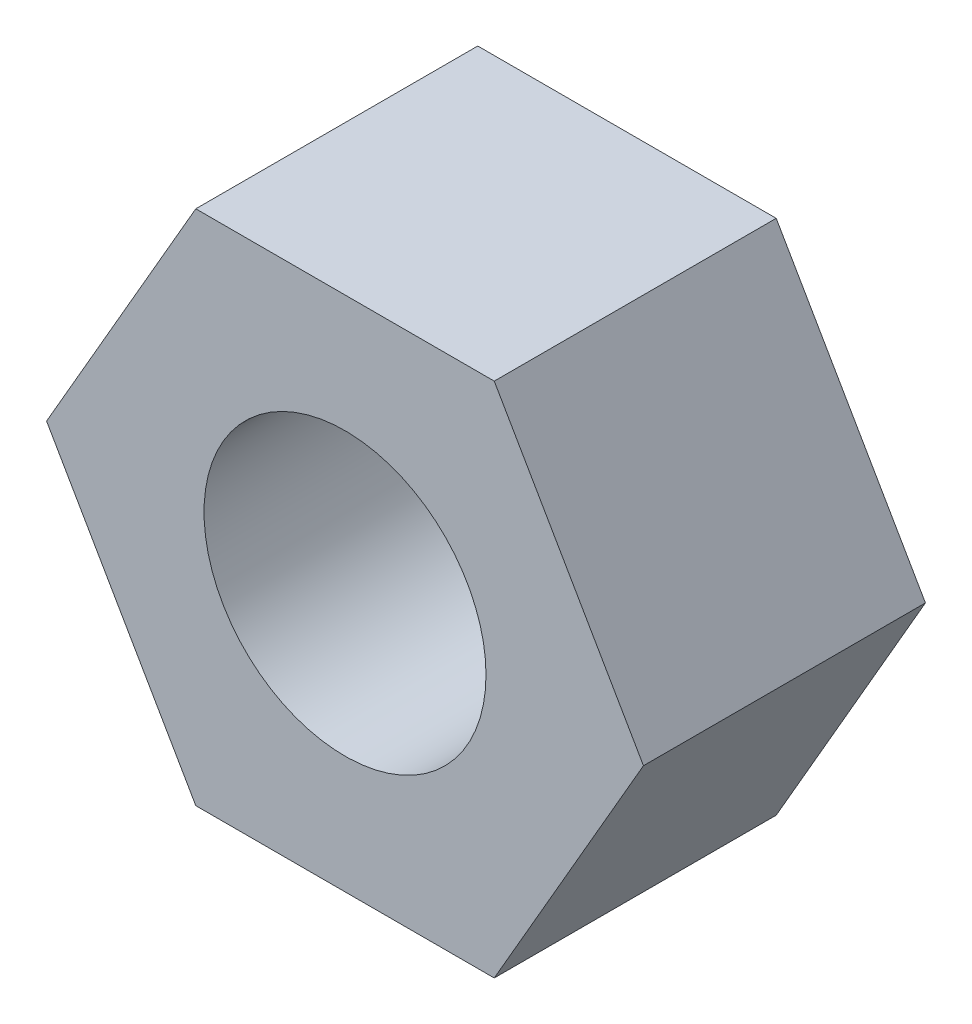
ISO-10303-21;
HEADER;
FILE_DESCRIPTION(('STEP AP214'),'2;1');
FILE_NAME('part.step','',(''),(''),'','','');
FILE_SCHEMA(('AUTOMOTIVE_DESIGN { 1 0 10303 214 1 1 1 1 }'));
ENDSEC;
DATA;
#1=APPLICATION_CONTEXT('core data for automotive mechanical design processes');
#2=APPLICATION_PROTOCOL_DEFINITION('international standard','automotive_design',2000,#1);
#3=PRODUCT_CONTEXT('',#1,'mechanical');
#4=PRODUCT('Part','Part','',(#3));
#5=PRODUCT_RELATED_PRODUCT_CATEGORY('part','',(#4));
#6=PRODUCT_DEFINITION_FORMATION('','',#4);
#7=PRODUCT_DEFINITION_CONTEXT('part definition',#1,'design');
#8=PRODUCT_DEFINITION('design','',#6,#7);
#9=PRODUCT_DEFINITION_SHAPE('','',#8);
#10=(LENGTH_UNIT() NAMED_UNIT(*) SI_UNIT(.MILLI.,.METRE.));
#11=(NAMED_UNIT(*) PLANE_ANGLE_UNIT() SI_UNIT($,.RADIAN.));
#12=(NAMED_UNIT(*) SI_UNIT($,.STERADIAN.) SOLID_ANGLE_UNIT());
#13=UNCERTAINTY_MEASURE_WITH_UNIT(LENGTH_MEASURE(1.E-05),#10,'distance_accuracy_value','');
#14=(GEOMETRIC_REPRESENTATION_CONTEXT(3) GLOBAL_UNCERTAINTY_ASSIGNED_CONTEXT((#13)) GLOBAL_UNIT_ASSIGNED_CONTEXT((#10,
#11,#12)) REPRESENTATION_CONTEXT('',''));
#15=CARTESIAN_POINT('',(0.,0.,0.));
#16=DIRECTION('',(0.,0.,1.));
#17=DIRECTION('',(1.,0.,0.));
#18=AXIS2_PLACEMENT_3D('',#15,#16,#17);
#19=CARTESIAN_POINT('',(0.,0.,3.));
#20=DIRECTION('',(0.,0.,1.));
#21=DIRECTION('',(1.,0.,0.));
#22=AXIS2_PLACEMENT_3D('',#19,#20,#21);
#23=PLANE('',#22);
#24=DIRECTION('',(0.499999999999999,0.866025403784439,0.));
#25=VECTOR('',#24,1.);
#26=CARTESIAN_POINT('',(-10.9122867597328,-48.4138723622024,3.));
#27=LINE('',#26,#25);
#28=CARTESIAN_POINT('',(-10.9122867597328,-48.4138723622024,3.));
#29=VERTEX_POINT('',#28);
#30=CARTESIAN_POINT('',(-9.32457351946133,-45.6638723622024,3.));
#31=VERTEX_POINT('',#30);
#32=EDGE_CURVE('E128',#29,#31,#27,.T.);
#33=ORIENTED_EDGE('',*,*,#32,.T.);
#34=DIRECTION('',(-0.500000000000001,0.866025403784438,0.));
#35=VECTOR('',#34,1.);
#36=CARTESIAN_POINT('',(-9.32457351946133,-45.6638723622024,3.));
#37=LINE('',#36,#35);
#38=CARTESIAN_POINT('',(-10.9122867597328,-42.9138723622024,3.));
#39=VERTEX_POINT('',#38);
#40=EDGE_CURVE('E86',#31,#39,#37,.T.);
#41=ORIENTED_EDGE('',*,*,#40,.T.);
#42=DIRECTION('',(-1.,0.,0.));
#43=VECTOR('',#42,1.);
#44=CARTESIAN_POINT('',(-10.9122867597328,-42.9138723622024,3.));
#45=LINE('',#44,#43);
#46=CARTESIAN_POINT('',(-14.0877132402757,-42.9138723622024,3.));
#47=VERTEX_POINT('',#46);
#48=EDGE_CURVE('E99',#39,#47,#45,.T.);
#49=ORIENTED_EDGE('',*,*,#48,.T.);
#50=DIRECTION('',(-0.499999999999999,-0.866025403784439,0.));
#51=VECTOR('',#50,1.);
#52=CARTESIAN_POINT('',(-14.0877132402757,-42.9138723622024,3.));
#53=LINE('',#52,#51);
#54=CARTESIAN_POINT('',(-15.6754264805472,-45.6638723622024,3.));
#55=VERTEX_POINT('',#54);
#56=EDGE_CURVE('E93',#47,#55,#53,.T.);
#57=ORIENTED_EDGE('',*,*,#56,.T.);
#58=DIRECTION('',(0.5,-0.866025403784439,0.));
#59=VECTOR('',#58,1.);
#60=CARTESIAN_POINT('',(-15.6754264805472,-45.6638723622024,3.));
#61=LINE('',#60,#59);
#62=CARTESIAN_POINT('',(-14.0877132402757,-48.4138723622024,3.));
#63=VERTEX_POINT('',#62);
#64=EDGE_CURVE('E97',#55,#63,#61,.T.);
#65=ORIENTED_EDGE('',*,*,#64,.T.);
#66=DIRECTION('',(1.,0.,0.));
#67=VECTOR('',#66,1.);
#68=CARTESIAN_POINT('',(-14.0877132402757,-48.4138723622024,3.));
#69=LINE('',#68,#67);
#70=EDGE_CURVE('E49',#63,#29,#69,.T.);
#71=ORIENTED_EDGE('',*,*,#70,.T.);
#72=EDGE_LOOP('',(#33,#41,#49,#57,#65,#71));
#73=FACE_BOUND('',#72,.T.);
#74=CARTESIAN_POINT('',(-12.5000000000043,-45.6638723622024,3.));
#75=DIRECTION('',(0.,0.,1.));
#76=DIRECTION('',(1.,0.,0.));
#77=AXIS2_PLACEMENT_3D('',#74,#75,#76);
#78=CIRCLE('',#77,1.5);
#79=CARTESIAN_POINT('',(-11.0000000000043,-45.6638723622024,3.));
#80=VERTEX_POINT('',#79);
#81=EDGE_CURVE('E121',#80,#80,#78,.T.);
#82=ORIENTED_EDGE('',*,*,#81,.F.);
#83=EDGE_LOOP('',(#82));
#84=FACE_BOUND('',#83,.T.);
#85=ADVANCED_FACE('F32',(#73,#84),#23,.T.);
#86=CARTESIAN_POINT('',(0.,0.,0.));
#87=DIRECTION('',(0.,0.,1.));
#88=DIRECTION('',(1.,0.,0.));
#89=AXIS2_PLACEMENT_3D('',#86,#87,#88);
#90=PLANE('',#89);
#91=DIRECTION('',(0.499999999999999,0.866025403784439,0.));
#92=VECTOR('',#91,1.);
#93=CARTESIAN_POINT('',(-10.9122867597328,-48.4138723622024,0.));
#94=LINE('',#93,#92);
#95=CARTESIAN_POINT('',(-10.9122867597328,-48.4138723622024,0.));
#96=VERTEX_POINT('',#95);
#97=CARTESIAN_POINT('',(-9.32457351946133,-45.6638723622024,0.));
#98=VERTEX_POINT('',#97);
#99=EDGE_CURVE('E117',#96,#98,#94,.T.);
#100=ORIENTED_EDGE('',*,*,#99,.F.);
#101=DIRECTION('',(1.,0.,0.));
#102=VECTOR('',#101,1.);
#103=CARTESIAN_POINT('',(-14.0877132402757,-48.4138723622024,0.));
#104=LINE('',#103,#102);
#105=CARTESIAN_POINT('',(-14.0877132402757,-48.4138723622024,0.));
#106=VERTEX_POINT('',#105);
#107=EDGE_CURVE('E78',#106,#96,#104,.T.);
#108=ORIENTED_EDGE('',*,*,#107,.F.);
#109=DIRECTION('',(0.5,-0.866025403784439,0.));
#110=VECTOR('',#109,1.);
#111=CARTESIAN_POINT('',(-15.6754264805472,-45.6638723622024,0.));
#112=LINE('',#111,#110);
#113=CARTESIAN_POINT('',(-15.6754264805472,-45.6638723622024,0.));
#114=VERTEX_POINT('',#113);
#115=EDGE_CURVE('E72',#114,#106,#112,.T.);
#116=ORIENTED_EDGE('',*,*,#115,.F.);
#117=DIRECTION('',(-0.499999999999999,-0.866025403784439,0.));
#118=VECTOR('',#117,1.);
#119=CARTESIAN_POINT('',(-14.0877132402757,-42.9138723622024,0.));
#120=LINE('',#119,#118);
#121=CARTESIAN_POINT('',(-14.0877132402757,-42.9138723622024,0.));
#122=VERTEX_POINT('',#121);
#123=EDGE_CURVE('E107',#122,#114,#120,.T.);
#124=ORIENTED_EDGE('',*,*,#123,.F.);
#125=DIRECTION('',(-1.,0.,0.));
#126=VECTOR('',#125,1.);
#127=CARTESIAN_POINT('',(-10.9122867597328,-42.9138723622024,0.));
#128=LINE('',#127,#126);
#129=CARTESIAN_POINT('',(-10.9122867597328,-42.9138723622024,0.));
#130=VERTEX_POINT('',#129);
#131=EDGE_CURVE('E123',#130,#122,#128,.T.);
#132=ORIENTED_EDGE('',*,*,#131,.F.);
#133=DIRECTION('',(-0.500000000000001,0.866025403784438,0.));
#134=VECTOR('',#133,1.);
#135=CARTESIAN_POINT('',(-9.32457351946133,-45.6638723622024,0.));
#136=LINE('',#135,#134);
#137=EDGE_CURVE('E120',#98,#130,#136,.T.);
#138=ORIENTED_EDGE('',*,*,#137,.F.);
#139=EDGE_LOOP('',(#100,#108,#116,#124,#132,#138));
#140=FACE_BOUND('',#139,.T.);
#141=CARTESIAN_POINT('',(-12.5000000000043,-45.6638723622024,0.));
#142=DIRECTION('',(0.,0.,1.));
#143=DIRECTION('',(1.,0.,0.));
#144=AXIS2_PLACEMENT_3D('',#141,#142,#143);
#145=CIRCLE('',#144,1.5);
#146=CARTESIAN_POINT('',(-11.0000000000043,-45.6638723622024,0.));
#147=VERTEX_POINT('',#146);
#148=EDGE_CURVE('E221',#147,#147,#145,.T.);
#149=ORIENTED_EDGE('',*,*,#148,.T.);
#150=EDGE_LOOP('',(#149));
#151=FACE_BOUND('',#150,.T.);
#152=ADVANCED_FACE('F137',(#140,#151),#90,.F.);
#153=CARTESIAN_POINT('',(-10.9122867597328,-48.4138723622024,3.));
#154=DIRECTION('',(-0.866025403784439,0.499999999999999,0.));
#155=DIRECTION('',(-0.499999999999999,-0.866025403784439,0.));
#156=AXIS2_PLACEMENT_3D('',#153,#154,#155);
#157=PLANE('',#156);
#158=ORIENTED_EDGE('',*,*,#99,.T.);
#159=DIRECTION('',(0.,0.,-1.));
#160=VECTOR('',#159,1.);
#161=CARTESIAN_POINT('',(-9.32457351946133,-45.6638723622024,3.));
#162=LINE('',#161,#160);
#163=EDGE_CURVE('E11',#31,#98,#162,.T.);
#164=ORIENTED_EDGE('',*,*,#163,.F.);
#165=ORIENTED_EDGE('',*,*,#32,.F.);
#166=DIRECTION('',(0.,0.,-1.));
#167=VECTOR('',#166,1.);
#168=CARTESIAN_POINT('',(-10.9122867597328,-48.4138723622024,3.));
#169=LINE('',#168,#167);
#170=EDGE_CURVE('E113',#29,#96,#169,.T.);
#171=ORIENTED_EDGE('',*,*,#170,.T.);
#172=EDGE_LOOP('',(#158,#164,#165,#171));
#173=FACE_BOUND('',#172,.T.);
#174=ADVANCED_FACE('F34',(#173),#157,.F.);
#175=CARTESIAN_POINT('',(-9.32457351946133,-45.6638723622024,3.));
#176=DIRECTION('',(-0.866025403784438,-0.500000000000001,0.));
#177=DIRECTION('',(0.500000000000001,-0.866025403784438,0.));
#178=AXIS2_PLACEMENT_3D('',#175,#176,#177);
#179=PLANE('',#178);
#180=ORIENTED_EDGE('',*,*,#137,.T.);
#181=DIRECTION('',(0.,0.,-1.));
#182=VECTOR('',#181,1.);
#183=CARTESIAN_POINT('',(-10.9122867597328,-42.9138723622024,3.));
#184=LINE('',#183,#182);
#185=EDGE_CURVE('E41',#39,#130,#184,.T.);
#186=ORIENTED_EDGE('',*,*,#185,.F.);
#187=ORIENTED_EDGE('',*,*,#40,.F.);
#188=ORIENTED_EDGE('',*,*,#163,.T.);
#189=EDGE_LOOP('',(#180,#186,#187,#188));
#190=FACE_BOUND('',#189,.T.);
#191=ADVANCED_FACE('F162',(#190),#179,.F.);
#192=CARTESIAN_POINT('',(-10.9122867597328,-42.9138723622024,3.));
#193=DIRECTION('',(0.,-1.,0.));
#194=DIRECTION('',(0.,0.,-1.));
#195=AXIS2_PLACEMENT_3D('',#192,#193,#194);
#196=PLANE('',#195);
#197=ORIENTED_EDGE('',*,*,#131,.T.);
#198=DIRECTION('',(0.,0.,-1.));
#199=VECTOR('',#198,1.);
#200=CARTESIAN_POINT('',(-14.0877132402757,-42.9138723622024,3.));
#201=LINE('',#200,#199);
#202=EDGE_CURVE('E108',#47,#122,#201,.T.);
#203=ORIENTED_EDGE('',*,*,#202,.F.);
#204=ORIENTED_EDGE('',*,*,#48,.F.);
#205=ORIENTED_EDGE('',*,*,#185,.T.);
#206=EDGE_LOOP('',(#197,#203,#204,#205));
#207=FACE_BOUND('',#206,.T.);
#208=ADVANCED_FACE('F134',(#207),#196,.F.);
#209=CARTESIAN_POINT('',(-14.0877132402757,-42.9138723622024,3.));
#210=DIRECTION('',(0.866025403784439,-0.499999999999999,0.));
#211=DIRECTION('',(0.499999999999999,0.866025403784439,0.));
#212=AXIS2_PLACEMENT_3D('',#209,#210,#211);
#213=PLANE('',#212);
#214=ORIENTED_EDGE('',*,*,#123,.T.);
#215=DIRECTION('',(0.,0.,-1.));
#216=VECTOR('',#215,1.);
#217=CARTESIAN_POINT('',(-15.6754264805472,-45.6638723622024,3.));
#218=LINE('',#217,#216);
#219=EDGE_CURVE('E104',#55,#114,#218,.T.);
#220=ORIENTED_EDGE('',*,*,#219,.F.);
#221=ORIENTED_EDGE('',*,*,#56,.F.);
#222=ORIENTED_EDGE('',*,*,#202,.T.);
#223=EDGE_LOOP('',(#214,#220,#221,#222));
#224=FACE_BOUND('',#223,.T.);
#225=ADVANCED_FACE('F105',(#224),#213,.F.);
#226=CARTESIAN_POINT('',(-15.6754264805472,-45.6638723622024,3.));
#227=DIRECTION('',(0.866025403784438,0.5,0.));
#228=DIRECTION('',(-0.5,0.866025403784439,0.));
#229=AXIS2_PLACEMENT_3D('',#226,#227,#228);
#230=PLANE('',#229);
#231=ORIENTED_EDGE('',*,*,#115,.T.);
#232=DIRECTION('',(0.,0.,-1.));
#233=VECTOR('',#232,1.);
#234=CARTESIAN_POINT('',(-14.0877132402757,-48.4138723622024,3.));
#235=LINE('',#234,#233);
#236=EDGE_CURVE('E109',#63,#106,#235,.T.);
#237=ORIENTED_EDGE('',*,*,#236,.F.);
#238=ORIENTED_EDGE('',*,*,#64,.F.);
#239=ORIENTED_EDGE('',*,*,#219,.T.);
#240=EDGE_LOOP('',(#231,#237,#238,#239));
#241=FACE_BOUND('',#240,.T.);
#242=ADVANCED_FACE('F111',(#241),#230,.F.);
#243=CARTESIAN_POINT('',(-14.0877132402757,-48.4138723622024,3.));
#244=DIRECTION('',(0.,1.,0.));
#245=DIRECTION('',(0.,0.,1.));
#246=AXIS2_PLACEMENT_3D('',#243,#244,#245);
#247=PLANE('',#246);
#248=ORIENTED_EDGE('',*,*,#107,.T.);
#249=ORIENTED_EDGE('',*,*,#170,.F.);
#250=ORIENTED_EDGE('',*,*,#70,.F.);
#251=ORIENTED_EDGE('',*,*,#236,.T.);
#252=EDGE_LOOP('',(#248,#249,#250,#251));
#253=FACE_BOUND('',#252,.T.);
#254=ADVANCED_FACE('F142',(#253),#247,.F.);
#255=CARTESIAN_POINT('',(-12.5000000000043,-45.6638723622024,3.));
#256=DIRECTION('',(0.,0.,-1.));
#257=DIRECTION('',(-1.,0.,0.));
#258=AXIS2_PLACEMENT_3D('',#255,#256,#257);
#259=CYLINDRICAL_SURFACE('',#258,1.5);
#260=ORIENTED_EDGE('',*,*,#81,.T.);
#261=EDGE_LOOP('',(#260));
#262=FACE_BOUND('',#261,.T.);
#263=ORIENTED_EDGE('',*,*,#148,.F.);
#264=EDGE_LOOP('',(#263));
#265=FACE_BOUND('',#264,.T.);
#266=ADVANCED_FACE('F144',(#262,#265),#259,.F.);
#267=CLOSED_SHELL('',(#85,#152,#174,#191,#208,#225,#242,#254,#266));
#268=MANIFOLD_SOLID_BREP('B2',#267);
#269=ADVANCED_BREP_SHAPE_REPRESENTATION('',(#18,#268),#14);
#270=SHAPE_DEFINITION_REPRESENTATION(#9,#269);
ENDSEC;
END-ISO-10303-21;
